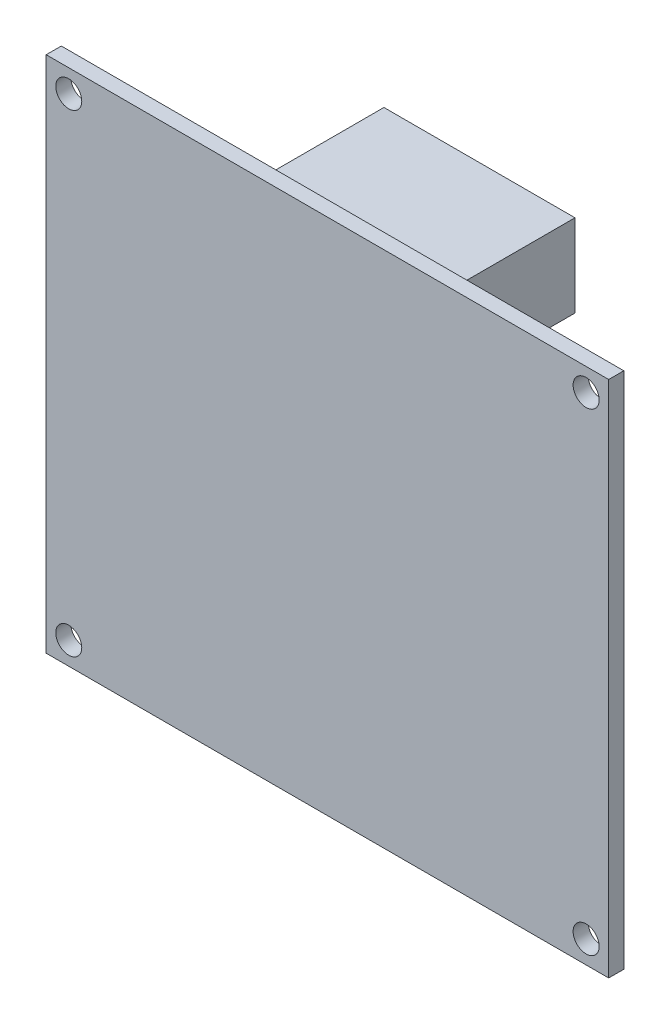
ISO-10303-21;
HEADER;
FILE_DESCRIPTION(('STEP AP214'),'2;1');
FILE_NAME('part.step','',(''),(''),'','','');
FILE_SCHEMA(('AUTOMOTIVE_DESIGN { 1 0 10303 214 1 1 1 1 }'));
ENDSEC;
DATA;
#1=APPLICATION_CONTEXT('core data for automotive mechanical design processes');
#2=APPLICATION_PROTOCOL_DEFINITION('international standard','automotive_design',2000,#1);
#3=PRODUCT_CONTEXT('',#1,'mechanical');
#4=PRODUCT('Part','Part','',(#3));
#5=PRODUCT_RELATED_PRODUCT_CATEGORY('part','',(#4));
#6=PRODUCT_DEFINITION_FORMATION('','',#4);
#7=PRODUCT_DEFINITION_CONTEXT('part definition',#1,'design');
#8=PRODUCT_DEFINITION('design','',#6,#7);
#9=PRODUCT_DEFINITION_SHAPE('','',#8);
#10=(LENGTH_UNIT() NAMED_UNIT(*) SI_UNIT(.MILLI.,.METRE.));
#11=(NAMED_UNIT(*) PLANE_ANGLE_UNIT() SI_UNIT($,.RADIAN.));
#12=(NAMED_UNIT(*) SI_UNIT($,.STERADIAN.) SOLID_ANGLE_UNIT());
#13=UNCERTAINTY_MEASURE_WITH_UNIT(LENGTH_MEASURE(1.E-05),#10,'distance_accuracy_value','');
#14=(GEOMETRIC_REPRESENTATION_CONTEXT(3) GLOBAL_UNCERTAINTY_ASSIGNED_CONTEXT((#13)) GLOBAL_UNIT_ASSIGNED_CONTEXT((#10,
#11,#12)) REPRESENTATION_CONTEXT('',''));
#15=CARTESIAN_POINT('',(0.,0.,0.));
#16=DIRECTION('',(0.,0.,1.));
#17=DIRECTION('',(1.,0.,0.));
#18=AXIS2_PLACEMENT_3D('',#15,#16,#17);
#19=CARTESIAN_POINT('',(30.734,28.321,-0.8255));
#20=DIRECTION('',(0.,0.,-1.));
#21=DIRECTION('',(-1.,0.,0.));
#22=AXIS2_PLACEMENT_3D('',#19,#20,#21);
#23=PLANE('',#22);
#24=CARTESIAN_POINT('',(-28.2702,-25.8572,-0.8255));
#25=DIRECTION('',(0.,0.,-1.));
#26=DIRECTION('',(-1.,0.,0.));
#27=AXIS2_PLACEMENT_3D('',#24,#25,#26);
#28=CIRCLE('',#27,1.4224);
#29=CARTESIAN_POINT('',(-26.8478,-25.8572,-0.8255));
#30=VERTEX_POINT('',#29);
#31=EDGE_CURVE('E220',#30,#30,#28,.T.);
#32=ORIENTED_EDGE('',*,*,#31,.F.);
#33=EDGE_LOOP('',(#32));
#34=FACE_BOUND('',#33,.T.);
#35=CARTESIAN_POINT('',(28.2702,-25.8572,-0.8255));
#36=DIRECTION('',(0.,0.,-1.));
#37=DIRECTION('',(-1.,0.,0.));
#38=AXIS2_PLACEMENT_3D('',#35,#36,#37);
#39=CIRCLE('',#38,1.4224);
#40=CARTESIAN_POINT('',(29.6926,-25.8572,-0.8255));
#41=VERTEX_POINT('',#40);
#42=EDGE_CURVE('E230',#41,#41,#39,.T.);
#43=ORIENTED_EDGE('',*,*,#42,.F.);
#44=EDGE_LOOP('',(#43));
#45=FACE_BOUND('',#44,.T.);
#46=CARTESIAN_POINT('',(28.2702,25.8572,-0.8255));
#47=DIRECTION('',(0.,0.,-1.));
#48=DIRECTION('',(-1.,0.,0.));
#49=AXIS2_PLACEMENT_3D('',#46,#47,#48);
#50=CIRCLE('',#49,1.4224);
#51=CARTESIAN_POINT('',(29.6926,25.8572,-0.8255));
#52=VERTEX_POINT('',#51);
#53=EDGE_CURVE('E236',#52,#52,#50,.T.);
#54=ORIENTED_EDGE('',*,*,#53,.F.);
#55=EDGE_LOOP('',(#54));
#56=FACE_BOUND('',#55,.T.);
#57=CARTESIAN_POINT('',(-28.2702,25.8572,-0.8255));
#58=DIRECTION('',(0.,0.,-1.));
#59=DIRECTION('',(-1.,0.,0.));
#60=AXIS2_PLACEMENT_3D('',#57,#58,#59);
#61=CIRCLE('',#60,1.4224);
#62=CARTESIAN_POINT('',(-26.8478,25.8572,-0.8255));
#63=VERTEX_POINT('',#62);
#64=EDGE_CURVE('E242',#63,#63,#61,.T.);
#65=ORIENTED_EDGE('',*,*,#64,.F.);
#66=EDGE_LOOP('',(#65));
#67=FACE_BOUND('',#66,.T.);
#68=DIRECTION('',(0.,1.,0.));
#69=VECTOR('',#68,1.);
#70=CARTESIAN_POINT('',(30.734,-28.321,-0.8255));
#71=LINE('',#70,#69);
#72=CARTESIAN_POINT('',(30.734,-28.321,-0.8255));
#73=VERTEX_POINT('',#72);
#74=CARTESIAN_POINT('',(30.734,28.321,-0.8255));
#75=VERTEX_POINT('',#74);
#76=EDGE_CURVE('E134',#73,#75,#71,.T.);
#77=ORIENTED_EDGE('',*,*,#76,.F.);
#78=DIRECTION('',(1.,0.,0.));
#79=VECTOR('',#78,1.);
#80=CARTESIAN_POINT('',(-30.734,-28.321,-0.8255));
#81=LINE('',#80,#79);
#82=CARTESIAN_POINT('',(-30.734,-28.321,-0.8255));
#83=VERTEX_POINT('',#82);
#84=EDGE_CURVE('E80',#83,#73,#81,.T.);
#85=ORIENTED_EDGE('',*,*,#84,.F.);
#86=DIRECTION('',(0.,-1.,0.));
#87=VECTOR('',#86,1.);
#88=CARTESIAN_POINT('',(-30.734,-28.321,-0.8255));
#89=LINE('',#88,#87);
#90=CARTESIAN_POINT('',(-30.734,28.321,-0.8255));
#91=VERTEX_POINT('',#90);
#92=EDGE_CURVE('E150',#91,#83,#89,.T.);
#93=ORIENTED_EDGE('',*,*,#92,.F.);
#94=DIRECTION('',(-1.,0.,0.));
#95=VECTOR('',#94,1.);
#96=CARTESIAN_POINT('',(-30.734,28.321,-0.8255));
#97=LINE('',#96,#95);
#98=EDGE_CURVE('E137',#75,#91,#97,.T.);
#99=ORIENTED_EDGE('',*,*,#98,.F.);
#100=EDGE_LOOP('',(#77,#85,#93,#99));
#101=FACE_BOUND('',#100,.T.);
#102=DIRECTION('',(-1.,0.,0.));
#103=VECTOR('',#102,1.);
#104=CARTESIAN_POINT('',(12.319,18.034,-0.8255));
#105=LINE('',#104,#103);
#106=CARTESIAN_POINT('',(12.319,18.034,-0.8255));
#107=VERTEX_POINT('',#106);
#108=CARTESIAN_POINT('',(-8.5598,18.034,-0.8255));
#109=VERTEX_POINT('',#108);
#110=EDGE_CURVE('E249',#107,#109,#105,.T.);
#111=ORIENTED_EDGE('',*,*,#110,.F.);
#112=DIRECTION('',(0.,-1.,0.));
#113=VECTOR('',#112,1.);
#114=CARTESIAN_POINT('',(12.319,18.034,-0.8255));
#115=LINE('',#114,#113);
#116=CARTESIAN_POINT('',(12.319,27.051,-0.8255));
#117=VERTEX_POINT('',#116);
#118=EDGE_CURVE('E132',#117,#107,#115,.T.);
#119=ORIENTED_EDGE('',*,*,#118,.F.);
#120=DIRECTION('',(1.,0.,0.));
#121=VECTOR('',#120,1.);
#122=CARTESIAN_POINT('',(12.319,27.051,-0.8255));
#123=LINE('',#122,#121);
#124=CARTESIAN_POINT('',(-8.5598,27.051,-0.8255));
#125=VERTEX_POINT('',#124);
#126=EDGE_CURVE('E128',#125,#117,#123,.T.);
#127=ORIENTED_EDGE('',*,*,#126,.F.);
#128=DIRECTION('',(0.,1.,0.));
#129=VECTOR('',#128,1.);
#130=CARTESIAN_POINT('',(-8.5598,18.034,-0.8255));
#131=LINE('',#130,#129);
#132=EDGE_CURVE('E251',#109,#125,#131,.T.);
#133=ORIENTED_EDGE('',*,*,#132,.F.);
#134=EDGE_LOOP('',(#111,#119,#127,#133));
#135=FACE_BOUND('',#134,.T.);
#136=ADVANCED_FACE('F35',(#34,#45,#56,#67,#101,#135),#23,.T.);
#137=CARTESIAN_POINT('',(30.734,-28.321,0.8255));
#138=DIRECTION('',(-1.,0.,0.));
#139=DIRECTION('',(0.,0.,1.));
#140=AXIS2_PLACEMENT_3D('',#137,#138,#139);
#141=PLANE('',#140);
#142=ORIENTED_EDGE('',*,*,#76,.T.);
#143=DIRECTION('',(0.,0.,-1.));
#144=VECTOR('',#143,1.);
#145=CARTESIAN_POINT('',(30.734,28.321,0.8255));
#146=LINE('',#145,#144);
#147=CARTESIAN_POINT('',(30.734,28.321,0.8255));
#148=VERTEX_POINT('',#147);
#149=EDGE_CURVE('E11',#148,#75,#146,.T.);
#150=ORIENTED_EDGE('',*,*,#149,.F.);
#151=DIRECTION('',(0.,1.,0.));
#152=VECTOR('',#151,1.);
#153=CARTESIAN_POINT('',(30.734,-28.321,0.8255));
#154=LINE('',#153,#152);
#155=CARTESIAN_POINT('',(30.734,-28.321,0.8255));
#156=VERTEX_POINT('',#155);
#157=EDGE_CURVE('E142',#156,#148,#154,.T.);
#158=ORIENTED_EDGE('',*,*,#157,.F.);
#159=DIRECTION('',(0.,0.,-1.));
#160=VECTOR('',#159,1.);
#161=CARTESIAN_POINT('',(30.734,-28.321,0.8255));
#162=LINE('',#161,#160);
#163=EDGE_CURVE('E147',#156,#73,#162,.T.);
#164=ORIENTED_EDGE('',*,*,#163,.T.);
#165=EDGE_LOOP('',(#142,#150,#158,#164));
#166=FACE_BOUND('',#165,.T.);
#167=ADVANCED_FACE('F37',(#166),#141,.F.);
#168=CARTESIAN_POINT('',(-30.734,28.321,0.8255));
#169=DIRECTION('',(0.,-1.,0.));
#170=DIRECTION('',(0.,0.,-1.));
#171=AXIS2_PLACEMENT_3D('',#168,#169,#170);
#172=PLANE('',#171);
#173=ORIENTED_EDGE('',*,*,#98,.T.);
#174=DIRECTION('',(0.,0.,-1.));
#175=VECTOR('',#174,1.);
#176=CARTESIAN_POINT('',(-30.734,28.321,0.8255));
#177=LINE('',#176,#175);
#178=CARTESIAN_POINT('',(-30.734,28.321,0.8255));
#179=VERTEX_POINT('',#178);
#180=EDGE_CURVE('E43',#179,#91,#177,.T.);
#181=ORIENTED_EDGE('',*,*,#180,.F.);
#182=DIRECTION('',(-1.,0.,0.));
#183=VECTOR('',#182,1.);
#184=CARTESIAN_POINT('',(-30.734,28.321,0.8255));
#185=LINE('',#184,#183);
#186=EDGE_CURVE('E87',#148,#179,#185,.T.);
#187=ORIENTED_EDGE('',*,*,#186,.F.);
#188=ORIENTED_EDGE('',*,*,#149,.T.);
#189=EDGE_LOOP('',(#173,#181,#187,#188));
#190=FACE_BOUND('',#189,.T.);
#191=ADVANCED_FACE('F177',(#190),#172,.F.);
#192=CARTESIAN_POINT('',(-30.734,-28.321,0.8255));
#193=DIRECTION('',(1.,0.,0.));
#194=DIRECTION('',(0.,0.,-1.));
#195=AXIS2_PLACEMENT_3D('',#192,#193,#194);
#196=PLANE('',#195);
#197=ORIENTED_EDGE('',*,*,#92,.T.);
#198=DIRECTION('',(0.,0.,-1.));
#199=VECTOR('',#198,1.);
#200=CARTESIAN_POINT('',(-30.734,-28.321,0.8255));
#201=LINE('',#200,#199);
#202=CARTESIAN_POINT('',(-30.734,-28.321,0.8255));
#203=VERTEX_POINT('',#202);
#204=EDGE_CURVE('E154',#203,#83,#201,.T.);
#205=ORIENTED_EDGE('',*,*,#204,.F.);
#206=DIRECTION('',(0.,-1.,0.));
#207=VECTOR('',#206,1.);
#208=CARTESIAN_POINT('',(-30.734,-28.321,0.8255));
#209=LINE('',#208,#207);
#210=EDGE_CURVE('E145',#179,#203,#209,.T.);
#211=ORIENTED_EDGE('',*,*,#210,.F.);
#212=ORIENTED_EDGE('',*,*,#180,.T.);
#213=EDGE_LOOP('',(#197,#205,#211,#212));
#214=FACE_BOUND('',#213,.T.);
#215=ADVANCED_FACE('F159',(#214),#196,.F.);
#216=CARTESIAN_POINT('',(-30.734,-28.321,0.8255));
#217=DIRECTION('',(0.,1.,0.));
#218=DIRECTION('',(0.,0.,1.));
#219=AXIS2_PLACEMENT_3D('',#216,#217,#218);
#220=PLANE('',#219);
#221=ORIENTED_EDGE('',*,*,#84,.T.);
#222=ORIENTED_EDGE('',*,*,#163,.F.);
#223=DIRECTION('',(1.,0.,0.));
#224=VECTOR('',#223,1.);
#225=CARTESIAN_POINT('',(-30.734,-28.321,0.8255));
#226=LINE('',#225,#224);
#227=EDGE_CURVE('E59',#203,#156,#226,.T.);
#228=ORIENTED_EDGE('',*,*,#227,.F.);
#229=ORIENTED_EDGE('',*,*,#204,.T.);
#230=EDGE_LOOP('',(#221,#222,#228,#229));
#231=FACE_BOUND('',#230,.T.);
#232=ADVANCED_FACE('F167',(#231),#220,.F.);
#233=CARTESIAN_POINT('',(30.734,28.321,0.8255));
#234=DIRECTION('',(0.,0.,-1.));
#235=DIRECTION('',(-1.,0.,0.));
#236=AXIS2_PLACEMENT_3D('',#233,#234,#235);
#237=PLANE('',#236);
#238=CARTESIAN_POINT('',(-28.2702,-25.8572,0.8255));
#239=DIRECTION('',(0.,0.,1.));
#240=DIRECTION('',(-1.,0.,0.));
#241=AXIS2_PLACEMENT_3D('',#238,#239,#240);
#242=CIRCLE('',#241,1.4224);
#243=CARTESIAN_POINT('',(-26.8478,-25.8572,0.8255));
#244=VERTEX_POINT('',#243);
#245=EDGE_CURVE('E223',#244,#244,#242,.T.);
#246=ORIENTED_EDGE('',*,*,#245,.F.);
#247=EDGE_LOOP('',(#246));
#248=FACE_BOUND('',#247,.T.);
#249=CARTESIAN_POINT('',(28.2702,-25.8572,0.8255));
#250=DIRECTION('',(0.,0.,1.));
#251=DIRECTION('',(1.,0.,0.));
#252=AXIS2_PLACEMENT_3D('',#249,#250,#251);
#253=CIRCLE('',#252,1.4224);
#254=CARTESIAN_POINT('',(29.6926,-25.8572,0.8255));
#255=VERTEX_POINT('',#254);
#256=EDGE_CURVE('E225',#255,#255,#253,.T.);
#257=ORIENTED_EDGE('',*,*,#256,.F.);
#258=EDGE_LOOP('',(#257));
#259=FACE_BOUND('',#258,.T.);
#260=CARTESIAN_POINT('',(28.2702,25.8572,0.8255));
#261=DIRECTION('',(0.,0.,1.));
#262=DIRECTION('',(-1.,0.,0.));
#263=AXIS2_PLACEMENT_3D('',#260,#261,#262);
#264=CIRCLE('',#263,1.4224);
#265=CARTESIAN_POINT('',(29.6926,25.8572,0.8255));
#266=VERTEX_POINT('',#265);
#267=EDGE_CURVE('E233',#266,#266,#264,.T.);
#268=ORIENTED_EDGE('',*,*,#267,.F.);
#269=EDGE_LOOP('',(#268));
#270=FACE_BOUND('',#269,.T.);
#271=CARTESIAN_POINT('',(-28.2702,25.8572,0.8255));
#272=DIRECTION('',(0.,0.,1.));
#273=DIRECTION('',(1.,0.,0.));
#274=AXIS2_PLACEMENT_3D('',#271,#272,#273);
#275=CIRCLE('',#274,1.4224);
#276=CARTESIAN_POINT('',(-26.8478,25.8572,0.8255));
#277=VERTEX_POINT('',#276);
#278=EDGE_CURVE('E239',#277,#277,#275,.T.);
#279=ORIENTED_EDGE('',*,*,#278,.F.);
#280=EDGE_LOOP('',(#279));
#281=FACE_BOUND('',#280,.T.);
#282=ORIENTED_EDGE('',*,*,#157,.T.);
#283=ORIENTED_EDGE('',*,*,#186,.T.);
#284=ORIENTED_EDGE('',*,*,#210,.T.);
#285=ORIENTED_EDGE('',*,*,#227,.T.);
#286=EDGE_LOOP('',(#282,#283,#284,#285));
#287=FACE_BOUND('',#286,.T.);
#288=ADVANCED_FACE('F169',(#248,#259,#270,#281,#287),#237,.F.);
#289=CARTESIAN_POINT('',(12.319,18.034,-13.9065));
#290=DIRECTION('',(-1.,0.,0.));
#291=DIRECTION('',(0.,0.,1.));
#292=AXIS2_PLACEMENT_3D('',#289,#290,#291);
#293=PLANE('',#292);
#294=ORIENTED_EDGE('',*,*,#118,.T.);
#295=DIRECTION('',(0.,0.,1.));
#296=VECTOR('',#295,1.);
#297=CARTESIAN_POINT('',(12.319,18.034,-13.9065));
#298=LINE('',#297,#296);
#299=CARTESIAN_POINT('',(12.319,18.034,-13.9065));
#300=VERTEX_POINT('',#299);
#301=EDGE_CURVE('E113',#300,#107,#298,.T.);
#302=ORIENTED_EDGE('',*,*,#301,.F.);
#303=DIRECTION('',(0.,-1.,0.));
#304=VECTOR('',#303,1.);
#305=CARTESIAN_POINT('',(12.319,18.034,-13.9065));
#306=LINE('',#305,#304);
#307=CARTESIAN_POINT('',(12.319,27.051,-13.9065));
#308=VERTEX_POINT('',#307);
#309=EDGE_CURVE('E120',#308,#300,#306,.T.);
#310=ORIENTED_EDGE('',*,*,#309,.F.);
#311=DIRECTION('',(0.,0.,1.));
#312=VECTOR('',#311,1.);
#313=CARTESIAN_POINT('',(12.319,27.051,-13.9065));
#314=LINE('',#313,#312);
#315=EDGE_CURVE('E247',#308,#117,#314,.T.);
#316=ORIENTED_EDGE('',*,*,#315,.T.);
#317=EDGE_LOOP('',(#294,#302,#310,#316));
#318=FACE_BOUND('',#317,.T.);
#319=ADVANCED_FACE('F130',(#318),#293,.F.);
#320=CARTESIAN_POINT('',(12.319,18.034,-13.9065));
#321=DIRECTION('',(0.,1.,0.));
#322=DIRECTION('',(0.,0.,1.));
#323=AXIS2_PLACEMENT_3D('',#320,#321,#322);
#324=PLANE('',#323);
#325=ORIENTED_EDGE('',*,*,#110,.T.);
#326=DIRECTION('',(0.,0.,1.));
#327=VECTOR('',#326,1.);
#328=CARTESIAN_POINT('',(-8.5598,18.034,-13.9065));
#329=LINE('',#328,#327);
#330=CARTESIAN_POINT('',(-8.5598,18.034,-13.9065));
#331=VERTEX_POINT('',#330);
#332=EDGE_CURVE('E116',#331,#109,#329,.T.);
#333=ORIENTED_EDGE('',*,*,#332,.F.);
#334=DIRECTION('',(-1.,0.,0.));
#335=VECTOR('',#334,1.);
#336=CARTESIAN_POINT('',(12.319,18.034,-13.9065));
#337=LINE('',#336,#335);
#338=EDGE_CURVE('E109',#300,#331,#337,.T.);
#339=ORIENTED_EDGE('',*,*,#338,.F.);
#340=ORIENTED_EDGE('',*,*,#301,.T.);
#341=EDGE_LOOP('',(#325,#333,#339,#340));
#342=FACE_BOUND('',#341,.T.);
#343=ADVANCED_FACE('F111',(#342),#324,.F.);
#344=CARTESIAN_POINT('',(-8.5598,18.034,-13.9065));
#345=DIRECTION('',(1.,0.,0.));
#346=DIRECTION('',(0.,0.,-1.));
#347=AXIS2_PLACEMENT_3D('',#344,#345,#346);
#348=PLANE('',#347);
#349=ORIENTED_EDGE('',*,*,#132,.T.);
#350=DIRECTION('',(0.,0.,1.));
#351=VECTOR('',#350,1.);
#352=CARTESIAN_POINT('',(-8.5598,27.051,-13.9065));
#353=LINE('',#352,#351);
#354=CARTESIAN_POINT('',(-8.5598,27.051,-13.9065));
#355=VERTEX_POINT('',#354);
#356=EDGE_CURVE('E50',#355,#125,#353,.T.);
#357=ORIENTED_EDGE('',*,*,#356,.F.);
#358=DIRECTION('',(0.,1.,0.));
#359=VECTOR('',#358,1.);
#360=CARTESIAN_POINT('',(-8.5598,18.034,-13.9065));
#361=LINE('',#360,#359);
#362=EDGE_CURVE('E119',#331,#355,#361,.T.);
#363=ORIENTED_EDGE('',*,*,#362,.F.);
#364=ORIENTED_EDGE('',*,*,#332,.T.);
#365=EDGE_LOOP('',(#349,#357,#363,#364));
#366=FACE_BOUND('',#365,.T.);
#367=ADVANCED_FACE('F192',(#366),#348,.F.);
#368=CARTESIAN_POINT('',(12.319,27.051,-13.9065));
#369=DIRECTION('',(0.,-1.,0.));
#370=DIRECTION('',(0.,0.,-1.));
#371=AXIS2_PLACEMENT_3D('',#368,#369,#370);
#372=PLANE('',#371);
#373=ORIENTED_EDGE('',*,*,#126,.T.);
#374=ORIENTED_EDGE('',*,*,#315,.F.);
#375=DIRECTION('',(1.,0.,0.));
#376=VECTOR('',#375,1.);
#377=CARTESIAN_POINT('',(12.319,27.051,-13.9065));
#378=LINE('',#377,#376);
#379=EDGE_CURVE('E124',#355,#308,#378,.T.);
#380=ORIENTED_EDGE('',*,*,#379,.F.);
#381=ORIENTED_EDGE('',*,*,#356,.T.);
#382=EDGE_LOOP('',(#373,#374,#380,#381));
#383=FACE_BOUND('',#382,.T.);
#384=ADVANCED_FACE('F195',(#383),#372,.F.);
#385=CARTESIAN_POINT('',(12.319,27.051,-13.9065));
#386=DIRECTION('',(0.,0.,1.));
#387=DIRECTION('',(1.,0.,0.));
#388=AXIS2_PLACEMENT_3D('',#385,#386,#387);
#389=PLANE('',#388);
#390=ORIENTED_EDGE('',*,*,#309,.T.);
#391=ORIENTED_EDGE('',*,*,#338,.T.);
#392=ORIENTED_EDGE('',*,*,#362,.T.);
#393=ORIENTED_EDGE('',*,*,#379,.T.);
#394=EDGE_LOOP('',(#390,#391,#392,#393));
#395=FACE_BOUND('',#394,.T.);
#396=ADVANCED_FACE('F123',(#395),#389,.F.);
#397=CARTESIAN_POINT('',(-28.2702,25.8572,-13.9065));
#398=DIRECTION('',(0.,0.,1.));
#399=DIRECTION('',(1.,0.,0.));
#400=AXIS2_PLACEMENT_3D('',#397,#398,#399);
#401=CYLINDRICAL_SURFACE('',#400,1.4224);
#402=CARTESIAN_POINT('',(-26.8478,25.8572,-0.8255));
#403=CARTESIAN_POINT('',(-26.8478,25.8572,-0.808302083333333));
#404=CARTESIAN_POINT('',(-26.8478,25.8572,-0.791104166666666));
#405=CARTESIAN_POINT('',(-26.8478,25.8572,-0.756708333333333));
#406=CARTESIAN_POINT('',(-26.8478,25.8572,-0.739510416666666));
#407=CARTESIAN_POINT('',(-26.8478,25.8572,-0.705114583333333));
#408=CARTESIAN_POINT('',(-26.8478,25.8572,-0.687916666666667));
#409=CARTESIAN_POINT('',(-26.8478,25.8572,-0.653520833333334));
#410=CARTESIAN_POINT('',(-26.8478,25.8572,-0.636322916666667));
#411=CARTESIAN_POINT('',(-26.8478,25.8572,-0.601927083333333));
#412=CARTESIAN_POINT('',(-26.8478,25.8572,-0.584729166666666));
#413=CARTESIAN_POINT('',(-26.8478,25.8572,-0.550333333333333));
#414=CARTESIAN_POINT('',(-26.8478,25.8572,-0.533135416666667));
#415=CARTESIAN_POINT('',(-26.8478,25.8572,-0.498739583333334));
#416=CARTESIAN_POINT('',(-26.8478,25.8572,-0.481541666666667));
#417=CARTESIAN_POINT('',(-26.8478,25.8572,-0.447145833333334));
#418=CARTESIAN_POINT('',(-26.8478,25.8572,-0.429947916666667));
#419=CARTESIAN_POINT('',(-26.8478,25.8572,-0.395552083333333));
#420=CARTESIAN_POINT('',(-26.8478,25.8572,-0.378354166666666));
#421=CARTESIAN_POINT('',(-26.8478,25.8572,-0.343958333333333));
#422=CARTESIAN_POINT('',(-26.8478,25.8572,-0.326760416666666));
#423=CARTESIAN_POINT('',(-26.8478,25.8572,-0.292364583333333));
#424=CARTESIAN_POINT('',(-26.8478,25.8572,-0.275166666666667));
#425=CARTESIAN_POINT('',(-26.8478,25.8572,-0.240770833333334));
#426=CARTESIAN_POINT('',(-26.8478,25.8572,-0.223572916666667));
#427=CARTESIAN_POINT('',(-26.8478,25.8572,-0.189177083333333));
#428=CARTESIAN_POINT('',(-26.8478,25.8572,-0.171979166666666));
#429=CARTESIAN_POINT('',(-26.8478,25.8572,-0.137583333333333));
#430=CARTESIAN_POINT('',(-26.8478,25.8572,-0.120385416666667));
#431=CARTESIAN_POINT('',(-26.8478,25.8572,-0.085989583333334));
#432=CARTESIAN_POINT('',(-26.8478,25.8572,-0.0687916666666672));
#433=CARTESIAN_POINT('',(-26.8478,25.8572,-0.0343958333333336));
#434=CARTESIAN_POINT('',(-26.8478,25.8572,-0.0171979166666668));
#435=CARTESIAN_POINT('',(-26.8478,25.8572,0.0171979166666668));
#436=CARTESIAN_POINT('',(-26.8478,25.8572,0.0343958333333336));
#437=CARTESIAN_POINT('',(-26.8478,25.8572,0.0687916666666672));
#438=CARTESIAN_POINT('',(-26.8478,25.8572,0.085989583333334));
#439=CARTESIAN_POINT('',(-26.8478,25.8572,0.120385416666667));
#440=CARTESIAN_POINT('',(-26.8478,25.8572,0.137583333333333));
#441=CARTESIAN_POINT('',(-26.8478,25.8572,0.171979166666666));
#442=CARTESIAN_POINT('',(-26.8478,25.8572,0.189177083333333));
#443=CARTESIAN_POINT('',(-26.8478,25.8572,0.223572916666667));
#444=CARTESIAN_POINT('',(-26.8478,25.8572,0.240770833333334));
#445=CARTESIAN_POINT('',(-26.8478,25.8572,0.275166666666667));
#446=CARTESIAN_POINT('',(-26.8478,25.8572,0.292364583333333));
#447=CARTESIAN_POINT('',(-26.8478,25.8572,0.326760416666666));
#448=CARTESIAN_POINT('',(-26.8478,25.8572,0.343958333333333));
#449=CARTESIAN_POINT('',(-26.8478,25.8572,0.378354166666666));
#450=CARTESIAN_POINT('',(-26.8478,25.8572,0.395552083333333));
#451=CARTESIAN_POINT('',(-26.8478,25.8572,0.429947916666667));
#452=CARTESIAN_POINT('',(-26.8478,25.8572,0.447145833333334));
#453=CARTESIAN_POINT('',(-26.8478,25.8572,0.481541666666667));
#454=CARTESIAN_POINT('',(-26.8478,25.8572,0.498739583333334));
#455=CARTESIAN_POINT('',(-26.8478,25.8572,0.533135416666667));
#456=CARTESIAN_POINT('',(-26.8478,25.8572,0.550333333333333));
#457=CARTESIAN_POINT('',(-26.8478,25.8572,0.584729166666666));
#458=CARTESIAN_POINT('',(-26.8478,25.8572,0.601927083333333));
#459=CARTESIAN_POINT('',(-26.8478,25.8572,0.636322916666667));
#460=CARTESIAN_POINT('',(-26.8478,25.8572,0.653520833333334));
#461=CARTESIAN_POINT('',(-26.8478,25.8572,0.687916666666667));
#462=CARTESIAN_POINT('',(-26.8478,25.8572,0.705114583333333));
#463=CARTESIAN_POINT('',(-26.8478,25.8572,0.739510416666666));
#464=CARTESIAN_POINT('',(-26.8478,25.8572,0.756708333333333));
#465=CARTESIAN_POINT('',(-26.8478,25.8572,0.791104166666666));
#466=CARTESIAN_POINT('',(-26.8478,25.8572,0.808302083333333));
#467=CARTESIAN_POINT('',(-26.8478,25.8572,0.8255));
#468=B_SPLINE_CURVE_WITH_KNOTS('',3,(#402,#403,#404,#405,#406,#407,#408,#409,#410,#411,#412,
#413,#414,#415,#416,#417,#418,#419,#420,#421,#422,#423,#424,#425,#426,#427,#428,#429,#430,#431,
#432,#433,#434,#435,#436,#437,#438,#439,#440,#441,#442,#443,#444,#445,#446,#447,#448,#449,#450,
#451,#452,#453,#454,#455,#456,#457,#458,#459,#460,#461,#462,#463,#464,#465,#466,#467),
.UNSPECIFIED.,.F.,.F.,(4,2,2,2,2,2,2,2,2,2,2,2,2,2,2,2,2,2,2,2,2,2,2,2,2,2,2,2,2,2,2,2,4),(0.,
0.0515937500000004,0.103187500000001,0.15478125,0.206375,0.25796875,0.309562499999999,
0.36115625,0.41275,0.46434375,0.515937500000001,0.567531249999999,0.619125,0.67071875,
0.722312499999999,0.773906249999999,0.8255,0.87709375,0.928687500000001,0.980281249999999,
1.031875,1.08346875,1.1350625,1.18665625,1.23825,1.28984375,1.3414375,1.39303125,1.444625,
1.49621875,1.5478125,1.59940625,1.651),.UNSPECIFIED.);
#469=EDGE_CURVE('BSEAM201',#63,#277,#468,.T.);
#470=ORIENTED_EDGE('',*,*,#64,.T.);
#471=ORIENTED_EDGE('',*,*,#278,.T.);
#472=ORIENTED_EDGE('',*,*,#469,.T.);
#473=ORIENTED_EDGE('',*,*,#469,.F.);
#474=EDGE_LOOP('',(#470,#472,#471,#473));
#475=FACE_BOUND('',#474,.T.);
#476=ADVANCED_FACE('F201',(#475),#401,.F.);
#477=CARTESIAN_POINT('',(28.2702,25.8572,-13.9065));
#478=DIRECTION('',(0.,0.,1.));
#479=DIRECTION('',(1.,0.,0.));
#480=AXIS2_PLACEMENT_3D('',#477,#478,#479);
#481=CYLINDRICAL_SURFACE('',#480,1.4224);
#482=CARTESIAN_POINT('',(29.6926,25.8572,-0.8255));
#483=CARTESIAN_POINT('',(29.6926,25.8572,-0.808302083333333));
#484=CARTESIAN_POINT('',(29.6926,25.8572,-0.791104166666666));
#485=CARTESIAN_POINT('',(29.6926,25.8572,-0.756708333333333));
#486=CARTESIAN_POINT('',(29.6926,25.8572,-0.739510416666666));
#487=CARTESIAN_POINT('',(29.6926,25.8572,-0.705114583333333));
#488=CARTESIAN_POINT('',(29.6926,25.8572,-0.687916666666667));
#489=CARTESIAN_POINT('',(29.6926,25.8572,-0.653520833333334));
#490=CARTESIAN_POINT('',(29.6926,25.8572,-0.636322916666667));
#491=CARTESIAN_POINT('',(29.6926,25.8572,-0.601927083333333));
#492=CARTESIAN_POINT('',(29.6926,25.8572,-0.584729166666666));
#493=CARTESIAN_POINT('',(29.6926,25.8572,-0.550333333333333));
#494=CARTESIAN_POINT('',(29.6926,25.8572,-0.533135416666667));
#495=CARTESIAN_POINT('',(29.6926,25.8572,-0.498739583333334));
#496=CARTESIAN_POINT('',(29.6926,25.8572,-0.481541666666667));
#497=CARTESIAN_POINT('',(29.6926,25.8572,-0.447145833333334));
#498=CARTESIAN_POINT('',(29.6926,25.8572,-0.429947916666667));
#499=CARTESIAN_POINT('',(29.6926,25.8572,-0.395552083333333));
#500=CARTESIAN_POINT('',(29.6926,25.8572,-0.378354166666666));
#501=CARTESIAN_POINT('',(29.6926,25.8572,-0.343958333333333));
#502=CARTESIAN_POINT('',(29.6926,25.8572,-0.326760416666666));
#503=CARTESIAN_POINT('',(29.6926,25.8572,-0.292364583333333));
#504=CARTESIAN_POINT('',(29.6926,25.8572,-0.275166666666667));
#505=CARTESIAN_POINT('',(29.6926,25.8572,-0.240770833333334));
#506=CARTESIAN_POINT('',(29.6926,25.8572,-0.223572916666667));
#507=CARTESIAN_POINT('',(29.6926,25.8572,-0.189177083333333));
#508=CARTESIAN_POINT('',(29.6926,25.8572,-0.171979166666666));
#509=CARTESIAN_POINT('',(29.6926,25.8572,-0.137583333333333));
#510=CARTESIAN_POINT('',(29.6926,25.8572,-0.120385416666667));
#511=CARTESIAN_POINT('',(29.6926,25.8572,-0.085989583333334));
#512=CARTESIAN_POINT('',(29.6926,25.8572,-0.0687916666666672));
#513=CARTESIAN_POINT('',(29.6926,25.8572,-0.0343958333333336));
#514=CARTESIAN_POINT('',(29.6926,25.8572,-0.0171979166666668));
#515=CARTESIAN_POINT('',(29.6926,25.8572,0.0171979166666668));
#516=CARTESIAN_POINT('',(29.6926,25.8572,0.0343958333333336));
#517=CARTESIAN_POINT('',(29.6926,25.8572,0.0687916666666672));
#518=CARTESIAN_POINT('',(29.6926,25.8572,0.085989583333334));
#519=CARTESIAN_POINT('',(29.6926,25.8572,0.120385416666667));
#520=CARTESIAN_POINT('',(29.6926,25.8572,0.137583333333333));
#521=CARTESIAN_POINT('',(29.6926,25.8572,0.171979166666666));
#522=CARTESIAN_POINT('',(29.6926,25.8572,0.189177083333333));
#523=CARTESIAN_POINT('',(29.6926,25.8572,0.223572916666667));
#524=CARTESIAN_POINT('',(29.6926,25.8572,0.240770833333334));
#525=CARTESIAN_POINT('',(29.6926,25.8572,0.275166666666667));
#526=CARTESIAN_POINT('',(29.6926,25.8572,0.292364583333333));
#527=CARTESIAN_POINT('',(29.6926,25.8572,0.326760416666666));
#528=CARTESIAN_POINT('',(29.6926,25.8572,0.343958333333333));
#529=CARTESIAN_POINT('',(29.6926,25.8572,0.378354166666666));
#530=CARTESIAN_POINT('',(29.6926,25.8572,0.395552083333333));
#531=CARTESIAN_POINT('',(29.6926,25.8572,0.429947916666667));
#532=CARTESIAN_POINT('',(29.6926,25.8572,0.447145833333334));
#533=CARTESIAN_POINT('',(29.6926,25.8572,0.481541666666667));
#534=CARTESIAN_POINT('',(29.6926,25.8572,0.498739583333334));
#535=CARTESIAN_POINT('',(29.6926,25.8572,0.533135416666667));
#536=CARTESIAN_POINT('',(29.6926,25.8572,0.550333333333333));
#537=CARTESIAN_POINT('',(29.6926,25.8572,0.584729166666666));
#538=CARTESIAN_POINT('',(29.6926,25.8572,0.601927083333333));
#539=CARTESIAN_POINT('',(29.6926,25.8572,0.636322916666667));
#540=CARTESIAN_POINT('',(29.6926,25.8572,0.653520833333334));
#541=CARTESIAN_POINT('',(29.6926,25.8572,0.687916666666667));
#542=CARTESIAN_POINT('',(29.6926,25.8572,0.705114583333333));
#543=CARTESIAN_POINT('',(29.6926,25.8572,0.739510416666666));
#544=CARTESIAN_POINT('',(29.6926,25.8572,0.756708333333333));
#545=CARTESIAN_POINT('',(29.6926,25.8572,0.791104166666666));
#546=CARTESIAN_POINT('',(29.6926,25.8572,0.808302083333333));
#547=CARTESIAN_POINT('',(29.6926,25.8572,0.8255));
#548=B_SPLINE_CURVE_WITH_KNOTS('',3,(#482,#483,#484,#485,#486,#487,#488,#489,#490,#491,#492,
#493,#494,#495,#496,#497,#498,#499,#500,#501,#502,#503,#504,#505,#506,#507,#508,#509,#510,#511,
#512,#513,#514,#515,#516,#517,#518,#519,#520,#521,#522,#523,#524,#525,#526,#527,#528,#529,#530,
#531,#532,#533,#534,#535,#536,#537,#538,#539,#540,#541,#542,#543,#544,#545,#546,#547),
.UNSPECIFIED.,.F.,.F.,(4,2,2,2,2,2,2,2,2,2,2,2,2,2,2,2,2,2,2,2,2,2,2,2,2,2,2,2,2,2,2,2,4),(0.,
0.0515937500000004,0.103187500000001,0.15478125,0.206375,0.25796875,0.309562499999999,
0.36115625,0.41275,0.46434375,0.515937500000001,0.567531249999999,0.619125,0.67071875,
0.722312499999999,0.773906249999999,0.8255,0.87709375,0.928687500000001,0.980281249999999,
1.031875,1.08346875,1.1350625,1.18665625,1.23825,1.28984375,1.3414375,1.39303125,1.444625,
1.49621875,1.5478125,1.59940625,1.651),.UNSPECIFIED.);
#549=EDGE_CURVE('BSEAM204',#52,#266,#548,.T.);
#550=ORIENTED_EDGE('',*,*,#53,.T.);
#551=ORIENTED_EDGE('',*,*,#267,.T.);
#552=ORIENTED_EDGE('',*,*,#549,.T.);
#553=ORIENTED_EDGE('',*,*,#549,.F.);
#554=EDGE_LOOP('',(#550,#552,#551,#553));
#555=FACE_BOUND('',#554,.T.);
#556=ADVANCED_FACE('F204',(#555),#481,.F.);
#557=CARTESIAN_POINT('',(28.2702,-25.8572,-13.9065));
#558=DIRECTION('',(0.,0.,1.));
#559=DIRECTION('',(1.,0.,0.));
#560=AXIS2_PLACEMENT_3D('',#557,#558,#559);
#561=CYLINDRICAL_SURFACE('',#560,1.4224);
#562=CARTESIAN_POINT('',(29.6926,-25.8572,-0.8255));
#563=CARTESIAN_POINT('',(29.6926,-25.8572,-0.808302083333333));
#564=CARTESIAN_POINT('',(29.6926,-25.8572,-0.791104166666666));
#565=CARTESIAN_POINT('',(29.6926,-25.8572,-0.756708333333333));
#566=CARTESIAN_POINT('',(29.6926,-25.8572,-0.739510416666666));
#567=CARTESIAN_POINT('',(29.6926,-25.8572,-0.705114583333333));
#568=CARTESIAN_POINT('',(29.6926,-25.8572,-0.687916666666667));
#569=CARTESIAN_POINT('',(29.6926,-25.8572,-0.653520833333334));
#570=CARTESIAN_POINT('',(29.6926,-25.8572,-0.636322916666667));
#571=CARTESIAN_POINT('',(29.6926,-25.8572,-0.601927083333333));
#572=CARTESIAN_POINT('',(29.6926,-25.8572,-0.584729166666666));
#573=CARTESIAN_POINT('',(29.6926,-25.8572,-0.550333333333333));
#574=CARTESIAN_POINT('',(29.6926,-25.8572,-0.533135416666667));
#575=CARTESIAN_POINT('',(29.6926,-25.8572,-0.498739583333334));
#576=CARTESIAN_POINT('',(29.6926,-25.8572,-0.481541666666667));
#577=CARTESIAN_POINT('',(29.6926,-25.8572,-0.447145833333334));
#578=CARTESIAN_POINT('',(29.6926,-25.8572,-0.429947916666667));
#579=CARTESIAN_POINT('',(29.6926,-25.8572,-0.395552083333333));
#580=CARTESIAN_POINT('',(29.6926,-25.8572,-0.378354166666666));
#581=CARTESIAN_POINT('',(29.6926,-25.8572,-0.343958333333333));
#582=CARTESIAN_POINT('',(29.6926,-25.8572,-0.326760416666666));
#583=CARTESIAN_POINT('',(29.6926,-25.8572,-0.292364583333333));
#584=CARTESIAN_POINT('',(29.6926,-25.8572,-0.275166666666667));
#585=CARTESIAN_POINT('',(29.6926,-25.8572,-0.240770833333334));
#586=CARTESIAN_POINT('',(29.6926,-25.8572,-0.223572916666667));
#587=CARTESIAN_POINT('',(29.6926,-25.8572,-0.189177083333333));
#588=CARTESIAN_POINT('',(29.6926,-25.8572,-0.171979166666666));
#589=CARTESIAN_POINT('',(29.6926,-25.8572,-0.137583333333333));
#590=CARTESIAN_POINT('',(29.6926,-25.8572,-0.120385416666667));
#591=CARTESIAN_POINT('',(29.6926,-25.8572,-0.085989583333334));
#592=CARTESIAN_POINT('',(29.6926,-25.8572,-0.0687916666666672));
#593=CARTESIAN_POINT('',(29.6926,-25.8572,-0.0343958333333336));
#594=CARTESIAN_POINT('',(29.6926,-25.8572,-0.0171979166666668));
#595=CARTESIAN_POINT('',(29.6926,-25.8572,0.0171979166666668));
#596=CARTESIAN_POINT('',(29.6926,-25.8572,0.0343958333333336));
#597=CARTESIAN_POINT('',(29.6926,-25.8572,0.0687916666666672));
#598=CARTESIAN_POINT('',(29.6926,-25.8572,0.085989583333334));
#599=CARTESIAN_POINT('',(29.6926,-25.8572,0.120385416666667));
#600=CARTESIAN_POINT('',(29.6926,-25.8572,0.137583333333333));
#601=CARTESIAN_POINT('',(29.6926,-25.8572,0.171979166666666));
#602=CARTESIAN_POINT('',(29.6926,-25.8572,0.189177083333333));
#603=CARTESIAN_POINT('',(29.6926,-25.8572,0.223572916666667));
#604=CARTESIAN_POINT('',(29.6926,-25.8572,0.240770833333334));
#605=CARTESIAN_POINT('',(29.6926,-25.8572,0.275166666666667));
#606=CARTESIAN_POINT('',(29.6926,-25.8572,0.292364583333333));
#607=CARTESIAN_POINT('',(29.6926,-25.8572,0.326760416666666));
#608=CARTESIAN_POINT('',(29.6926,-25.8572,0.343958333333333));
#609=CARTESIAN_POINT('',(29.6926,-25.8572,0.378354166666666));
#610=CARTESIAN_POINT('',(29.6926,-25.8572,0.395552083333333));
#611=CARTESIAN_POINT('',(29.6926,-25.8572,0.429947916666667));
#612=CARTESIAN_POINT('',(29.6926,-25.8572,0.447145833333334));
#613=CARTESIAN_POINT('',(29.6926,-25.8572,0.481541666666667));
#614=CARTESIAN_POINT('',(29.6926,-25.8572,0.498739583333334));
#615=CARTESIAN_POINT('',(29.6926,-25.8572,0.533135416666667));
#616=CARTESIAN_POINT('',(29.6926,-25.8572,0.550333333333333));
#617=CARTESIAN_POINT('',(29.6926,-25.8572,0.584729166666666));
#618=CARTESIAN_POINT('',(29.6926,-25.8572,0.601927083333333));
#619=CARTESIAN_POINT('',(29.6926,-25.8572,0.636322916666667));
#620=CARTESIAN_POINT('',(29.6926,-25.8572,0.653520833333334));
#621=CARTESIAN_POINT('',(29.6926,-25.8572,0.687916666666667));
#622=CARTESIAN_POINT('',(29.6926,-25.8572,0.705114583333333));
#623=CARTESIAN_POINT('',(29.6926,-25.8572,0.739510416666666));
#624=CARTESIAN_POINT('',(29.6926,-25.8572,0.756708333333333));
#625=CARTESIAN_POINT('',(29.6926,-25.8572,0.791104166666666));
#626=CARTESIAN_POINT('',(29.6926,-25.8572,0.808302083333333));
#627=CARTESIAN_POINT('',(29.6926,-25.8572,0.8255));
#628=B_SPLINE_CURVE_WITH_KNOTS('',3,(#562,#563,#564,#565,#566,#567,#568,#569,#570,#571,#572,
#573,#574,#575,#576,#577,#578,#579,#580,#581,#582,#583,#584,#585,#586,#587,#588,#589,#590,#591,
#592,#593,#594,#595,#596,#597,#598,#599,#600,#601,#602,#603,#604,#605,#606,#607,#608,#609,#610,
#611,#612,#613,#614,#615,#616,#617,#618,#619,#620,#621,#622,#623,#624,#625,#626,#627),
.UNSPECIFIED.,.F.,.F.,(4,2,2,2,2,2,2,2,2,2,2,2,2,2,2,2,2,2,2,2,2,2,2,2,2,2,2,2,2,2,2,2,4),(0.,
0.0515937500000004,0.103187500000001,0.15478125,0.206375,0.25796875,0.309562499999999,
0.36115625,0.41275,0.46434375,0.515937500000001,0.567531249999999,0.619125,0.67071875,
0.722312499999999,0.773906249999999,0.8255,0.87709375,0.928687500000001,0.980281249999999,
1.031875,1.08346875,1.1350625,1.18665625,1.23825,1.28984375,1.3414375,1.39303125,1.444625,
1.49621875,1.5478125,1.59940625,1.651),.UNSPECIFIED.);
#629=EDGE_CURVE('BSEAM208',#41,#255,#628,.T.);
#630=ORIENTED_EDGE('',*,*,#42,.T.);
#631=ORIENTED_EDGE('',*,*,#256,.T.);
#632=ORIENTED_EDGE('',*,*,#629,.T.);
#633=ORIENTED_EDGE('',*,*,#629,.F.);
#634=EDGE_LOOP('',(#630,#632,#631,#633));
#635=FACE_BOUND('',#634,.T.);
#636=ADVANCED_FACE('F208',(#635),#561,.F.);
#637=CARTESIAN_POINT('',(-28.2702,-25.8572,-13.9065));
#638=DIRECTION('',(0.,0.,1.));
#639=DIRECTION('',(1.,0.,0.));
#640=AXIS2_PLACEMENT_3D('',#637,#638,#639);
#641=CYLINDRICAL_SURFACE('',#640,1.4224);
#642=CARTESIAN_POINT('',(-26.8478,-25.8572,-0.8255));
#643=CARTESIAN_POINT('',(-26.8478,-25.8572,-0.808302083333333));
#644=CARTESIAN_POINT('',(-26.8478,-25.8572,-0.791104166666666));
#645=CARTESIAN_POINT('',(-26.8478,-25.8572,-0.756708333333333));
#646=CARTESIAN_POINT('',(-26.8478,-25.8572,-0.739510416666666));
#647=CARTESIAN_POINT('',(-26.8478,-25.8572,-0.705114583333333));
#648=CARTESIAN_POINT('',(-26.8478,-25.8572,-0.687916666666667));
#649=CARTESIAN_POINT('',(-26.8478,-25.8572,-0.653520833333334));
#650=CARTESIAN_POINT('',(-26.8478,-25.8572,-0.636322916666667));
#651=CARTESIAN_POINT('',(-26.8478,-25.8572,-0.601927083333333));
#652=CARTESIAN_POINT('',(-26.8478,-25.8572,-0.584729166666666));
#653=CARTESIAN_POINT('',(-26.8478,-25.8572,-0.550333333333333));
#654=CARTESIAN_POINT('',(-26.8478,-25.8572,-0.533135416666667));
#655=CARTESIAN_POINT('',(-26.8478,-25.8572,-0.498739583333334));
#656=CARTESIAN_POINT('',(-26.8478,-25.8572,-0.481541666666667));
#657=CARTESIAN_POINT('',(-26.8478,-25.8572,-0.447145833333334));
#658=CARTESIAN_POINT('',(-26.8478,-25.8572,-0.429947916666667));
#659=CARTESIAN_POINT('',(-26.8478,-25.8572,-0.395552083333333));
#660=CARTESIAN_POINT('',(-26.8478,-25.8572,-0.378354166666666));
#661=CARTESIAN_POINT('',(-26.8478,-25.8572,-0.343958333333333));
#662=CARTESIAN_POINT('',(-26.8478,-25.8572,-0.326760416666666));
#663=CARTESIAN_POINT('',(-26.8478,-25.8572,-0.292364583333333));
#664=CARTESIAN_POINT('',(-26.8478,-25.8572,-0.275166666666667));
#665=CARTESIAN_POINT('',(-26.8478,-25.8572,-0.240770833333334));
#666=CARTESIAN_POINT('',(-26.8478,-25.8572,-0.223572916666667));
#667=CARTESIAN_POINT('',(-26.8478,-25.8572,-0.189177083333333));
#668=CARTESIAN_POINT('',(-26.8478,-25.8572,-0.171979166666666));
#669=CARTESIAN_POINT('',(-26.8478,-25.8572,-0.137583333333333));
#670=CARTESIAN_POINT('',(-26.8478,-25.8572,-0.120385416666667));
#671=CARTESIAN_POINT('',(-26.8478,-25.8572,-0.085989583333334));
#672=CARTESIAN_POINT('',(-26.8478,-25.8572,-0.0687916666666672));
#673=CARTESIAN_POINT('',(-26.8478,-25.8572,-0.0343958333333336));
#674=CARTESIAN_POINT('',(-26.8478,-25.8572,-0.0171979166666668));
#675=CARTESIAN_POINT('',(-26.8478,-25.8572,0.0171979166666668));
#676=CARTESIAN_POINT('',(-26.8478,-25.8572,0.0343958333333336));
#677=CARTESIAN_POINT('',(-26.8478,-25.8572,0.0687916666666672));
#678=CARTESIAN_POINT('',(-26.8478,-25.8572,0.085989583333334));
#679=CARTESIAN_POINT('',(-26.8478,-25.8572,0.120385416666667));
#680=CARTESIAN_POINT('',(-26.8478,-25.8572,0.137583333333333));
#681=CARTESIAN_POINT('',(-26.8478,-25.8572,0.171979166666666));
#682=CARTESIAN_POINT('',(-26.8478,-25.8572,0.189177083333333));
#683=CARTESIAN_POINT('',(-26.8478,-25.8572,0.223572916666667));
#684=CARTESIAN_POINT('',(-26.8478,-25.8572,0.240770833333334));
#685=CARTESIAN_POINT('',(-26.8478,-25.8572,0.275166666666667));
#686=CARTESIAN_POINT('',(-26.8478,-25.8572,0.292364583333333));
#687=CARTESIAN_POINT('',(-26.8478,-25.8572,0.326760416666666));
#688=CARTESIAN_POINT('',(-26.8478,-25.8572,0.343958333333333));
#689=CARTESIAN_POINT('',(-26.8478,-25.8572,0.378354166666666));
#690=CARTESIAN_POINT('',(-26.8478,-25.8572,0.395552083333333));
#691=CARTESIAN_POINT('',(-26.8478,-25.8572,0.429947916666667));
#692=CARTESIAN_POINT('',(-26.8478,-25.8572,0.447145833333334));
#693=CARTESIAN_POINT('',(-26.8478,-25.8572,0.481541666666667));
#694=CARTESIAN_POINT('',(-26.8478,-25.8572,0.498739583333334));
#695=CARTESIAN_POINT('',(-26.8478,-25.8572,0.533135416666667));
#696=CARTESIAN_POINT('',(-26.8478,-25.8572,0.550333333333333));
#697=CARTESIAN_POINT('',(-26.8478,-25.8572,0.584729166666666));
#698=CARTESIAN_POINT('',(-26.8478,-25.8572,0.601927083333333));
#699=CARTESIAN_POINT('',(-26.8478,-25.8572,0.636322916666667));
#700=CARTESIAN_POINT('',(-26.8478,-25.8572,0.653520833333334));
#701=CARTESIAN_POINT('',(-26.8478,-25.8572,0.687916666666667));
#702=CARTESIAN_POINT('',(-26.8478,-25.8572,0.705114583333333));
#703=CARTESIAN_POINT('',(-26.8478,-25.8572,0.739510416666666));
#704=CARTESIAN_POINT('',(-26.8478,-25.8572,0.756708333333333));
#705=CARTESIAN_POINT('',(-26.8478,-25.8572,0.791104166666666));
#706=CARTESIAN_POINT('',(-26.8478,-25.8572,0.808302083333333));
#707=CARTESIAN_POINT('',(-26.8478,-25.8572,0.8255));
#708=B_SPLINE_CURVE_WITH_KNOTS('',3,(#642,#643,#644,#645,#646,#647,#648,#649,#650,#651,#652,
#653,#654,#655,#656,#657,#658,#659,#660,#661,#662,#663,#664,#665,#666,#667,#668,#669,#670,#671,
#672,#673,#674,#675,#676,#677,#678,#679,#680,#681,#682,#683,#684,#685,#686,#687,#688,#689,#690,
#691,#692,#693,#694,#695,#696,#697,#698,#699,#700,#701,#702,#703,#704,#705,#706,#707),
.UNSPECIFIED.,.F.,.F.,(4,2,2,2,2,2,2,2,2,2,2,2,2,2,2,2,2,2,2,2,2,2,2,2,2,2,2,2,2,2,2,2,4),(0.,
0.0515937500000004,0.103187500000001,0.15478125,0.206375,0.25796875,0.309562499999999,
0.36115625,0.41275,0.46434375,0.515937500000001,0.567531249999999,0.619125,0.67071875,
0.722312499999999,0.773906249999999,0.8255,0.87709375,0.928687500000001,0.980281249999999,
1.031875,1.08346875,1.1350625,1.18665625,1.23825,1.28984375,1.3414375,1.39303125,1.444625,
1.49621875,1.5478125,1.59940625,1.651),.UNSPECIFIED.);
#709=EDGE_CURVE('BSEAM212',#30,#244,#708,.T.);
#710=ORIENTED_EDGE('',*,*,#31,.T.);
#711=ORIENTED_EDGE('',*,*,#245,.T.);
#712=ORIENTED_EDGE('',*,*,#709,.T.);
#713=ORIENTED_EDGE('',*,*,#709,.F.);
#714=EDGE_LOOP('',(#710,#712,#711,#713));
#715=FACE_BOUND('',#714,.T.);
#716=ADVANCED_FACE('F212',(#715),#641,.F.);
#717=CLOSED_SHELL('',(#136,#167,#191,#215,#232,#288,#319,#343,#367,#384,#396,#476,#556,#636,#716));
#718=MANIFOLD_SOLID_BREP('B2',#717);
#719=ADVANCED_BREP_SHAPE_REPRESENTATION('',(#18,#718),#14);
#720=SHAPE_DEFINITION_REPRESENTATION(#9,#719);
ENDSEC;
END-ISO-10303-21;
